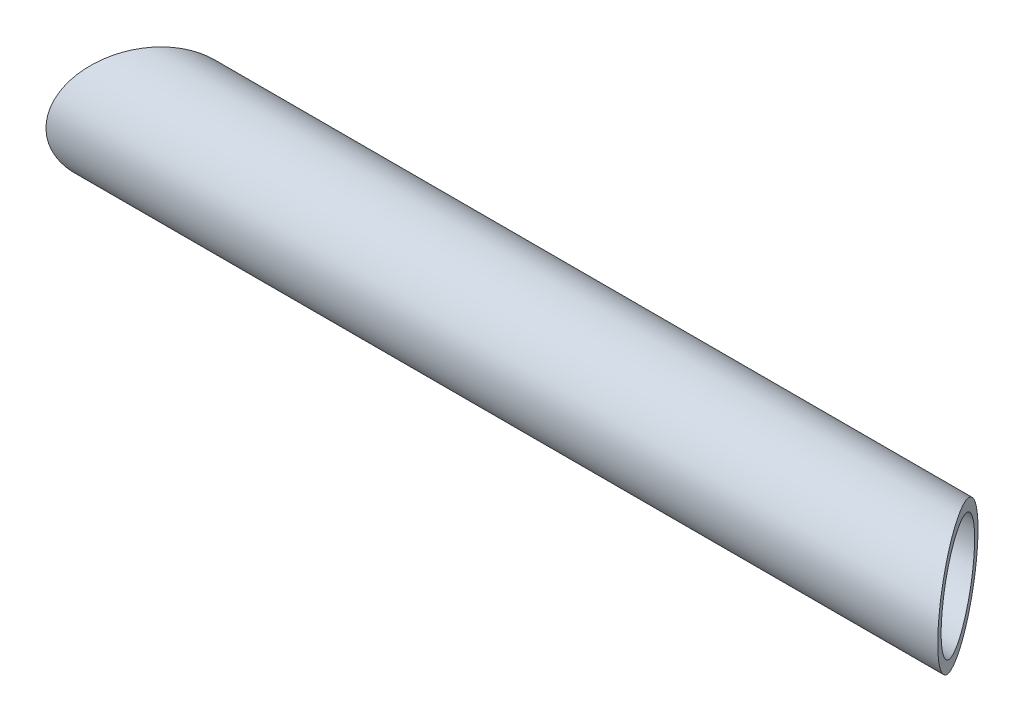
ISO-10303-21;
HEADER;
FILE_DESCRIPTION(('STEP AP214'),'2;1');
FILE_NAME('part.step','',(''),(''),'','','');
FILE_SCHEMA(('AUTOMOTIVE_DESIGN { 1 0 10303 214 1 1 1 1 }'));
ENDSEC;
DATA;
#1=APPLICATION_CONTEXT('core data for automotive mechanical design processes');
#2=APPLICATION_PROTOCOL_DEFINITION('international standard','automotive_design',2000,#1);
#3=PRODUCT_CONTEXT('',#1,'mechanical');
#4=PRODUCT('Part','Part','',(#3));
#5=PRODUCT_RELATED_PRODUCT_CATEGORY('part','',(#4));
#6=PRODUCT_DEFINITION_FORMATION('','',#4);
#7=PRODUCT_DEFINITION_CONTEXT('part definition',#1,'design');
#8=PRODUCT_DEFINITION('design','',#6,#7);
#9=PRODUCT_DEFINITION_SHAPE('','',#8);
#10=(LENGTH_UNIT() NAMED_UNIT(*) SI_UNIT(.MILLI.,.METRE.));
#11=(NAMED_UNIT(*) PLANE_ANGLE_UNIT() SI_UNIT($,.RADIAN.));
#12=(NAMED_UNIT(*) SI_UNIT($,.STERADIAN.) SOLID_ANGLE_UNIT());
#13=UNCERTAINTY_MEASURE_WITH_UNIT(LENGTH_MEASURE(1.E-05),#10,'distance_accuracy_value','');
#14=(GEOMETRIC_REPRESENTATION_CONTEXT(3) GLOBAL_UNCERTAINTY_ASSIGNED_CONTEXT((#13)) GLOBAL_UNIT_ASSIGNED_CONTEXT((#10,
#11,#12)) REPRESENTATION_CONTEXT('',''));
#15=CARTESIAN_POINT('',(0.,0.,0.));
#16=DIRECTION('',(0.,0.,1.));
#17=DIRECTION('',(1.,0.,0.));
#18=AXIS2_PLACEMENT_3D('',#15,#16,#17);
#19=CARTESIAN_POINT('',(-65.,0.,0.));
#20=DIRECTION('',(1.,0.,0.));
#21=DIRECTION('',(0.,0.,-1.));
#22=AXIS2_PLACEMENT_3D('',#19,#20,#21);
#23=CYLINDRICAL_SURFACE('',#22,7.9);
#24=CARTESIAN_POINT('',(-65.,0.,0.));
#25=DIRECTION('',(-0.834008585191079,0.,-0.551751465632466));
#26=DIRECTION('',(0.551751465632466,0.,-0.834008585191079));
#27=AXIS2_PLACEMENT_3D('',#24,#25,#26);
#28=ELLIPSE('',#27,9.47232455429705,7.9);
#29=CARTESIAN_POINT('',(-59.7736310442202,0.,-7.89999999999999));
#30=VERTEX_POINT('',#29);
#31=EDGE_CURVE('E53',#30,#30,#28,.T.);
#32=ORIENTED_EDGE('',*,*,#31,.T.);
#33=EDGE_LOOP('',(#32));
#34=FACE_BOUND('',#33,.T.);
#35=CARTESIAN_POINT('',(65.,0.,0.));
#36=DIRECTION('',(0.834008585191079,0.,-0.551751465632466));
#37=DIRECTION('',(0.551751465632466,0.,0.834008585191079));
#38=AXIS2_PLACEMENT_3D('',#35,#36,#37);
#39=ELLIPSE('',#38,9.47232455429705,7.9);
#40=CARTESIAN_POINT('',(70.2263689557798,0.,7.90000000000002));
#41=VERTEX_POINT('',#40);
#42=EDGE_CURVE('E43',#41,#41,#39,.T.);
#43=ORIENTED_EDGE('',*,*,#42,.T.);
#44=EDGE_LOOP('',(#43));
#45=FACE_BOUND('',#44,.T.);
#46=ADVANCED_FACE('F39',(#34,#45),#23,.F.);
#47=CARTESIAN_POINT('',(-65.,0.,0.));
#48=DIRECTION('',(1.,0.,0.));
#49=DIRECTION('',(0.,0.,-1.));
#50=AXIS2_PLACEMENT_3D('',#47,#48,#49);
#51=CYLINDRICAL_SURFACE('',#50,9.5);
#52=CARTESIAN_POINT('',(-65.,0.,0.));
#53=DIRECTION('',(-0.834008585191079,0.,-0.551751465632466));
#54=DIRECTION('',(0.551751465632466,0.,-0.834008585191079));
#55=AXIS2_PLACEMENT_3D('',#52,#53,#54);
#56=ELLIPSE('',#55,11.3907700336483,9.5);
#57=CARTESIAN_POINT('',(-58.7151259392522,0.,-9.49999999999998));
#58=VERTEX_POINT('',#57);
#59=EDGE_CURVE('E47',#58,#58,#56,.T.);
#60=ORIENTED_EDGE('',*,*,#59,.F.);
#61=EDGE_LOOP('',(#60));
#62=FACE_BOUND('',#61,.T.);
#63=CARTESIAN_POINT('',(65.,0.,0.));
#64=DIRECTION('',(0.834008585191079,0.,-0.551751465632466));
#65=DIRECTION('',(0.551751465632466,0.,0.834008585191079));
#66=AXIS2_PLACEMENT_3D('',#63,#64,#65);
#67=ELLIPSE('',#66,11.3907700336483,9.5);
#68=CARTESIAN_POINT('',(71.2848740607479,0.,9.50000000000001));
#69=VERTEX_POINT('',#68);
#70=EDGE_CURVE('E10',#69,#69,#67,.T.);
#71=ORIENTED_EDGE('',*,*,#70,.F.);
#72=EDGE_LOOP('',(#71));
#73=FACE_BOUND('',#72,.T.);
#74=ADVANCED_FACE('F67',(#62,#73),#51,.T.);
#75=CARTESIAN_POINT('',(-65.,0.,0.));
#76=DIRECTION('',(-0.834008585191079,0.,-0.551751465632466));
#77=DIRECTION('',(-0.551751465632466,0.,0.834008585191079));
#78=AXIS2_PLACEMENT_3D('',#75,#76,#77);
#79=PLANE('',#78);
#80=ORIENTED_EDGE('',*,*,#31,.F.);
#81=EDGE_LOOP('',(#80));
#82=FACE_BOUND('',#81,.T.);
#83=ORIENTED_EDGE('',*,*,#59,.T.);
#84=EDGE_LOOP('',(#83));
#85=FACE_BOUND('',#84,.T.);
#86=ADVANCED_FACE('F62',(#82,#85),#79,.T.);
#87=CARTESIAN_POINT('',(65.,0.,0.));
#88=DIRECTION('',(0.834008585191079,0.,-0.551751465632466));
#89=DIRECTION('',(-0.551751465632466,0.,-0.834008585191079));
#90=AXIS2_PLACEMENT_3D('',#87,#88,#89);
#91=PLANE('',#90);
#92=ORIENTED_EDGE('',*,*,#42,.F.);
#93=EDGE_LOOP('',(#92));
#94=FACE_BOUND('',#93,.T.);
#95=ORIENTED_EDGE('',*,*,#70,.T.);
#96=EDGE_LOOP('',(#95));
#97=FACE_BOUND('',#96,.T.);
#98=ADVANCED_FACE('F41',(#94,#97),#91,.T.);
#99=CLOSED_SHELL('',(#46,#74,#86,#98));
#100=MANIFOLD_SOLID_BREP('B2',#99);
#101=ADVANCED_BREP_SHAPE_REPRESENTATION('',(#18,#100),#14);
#102=SHAPE_DEFINITION_REPRESENTATION(#9,#101);
ENDSEC;
END-ISO-10303-21;
